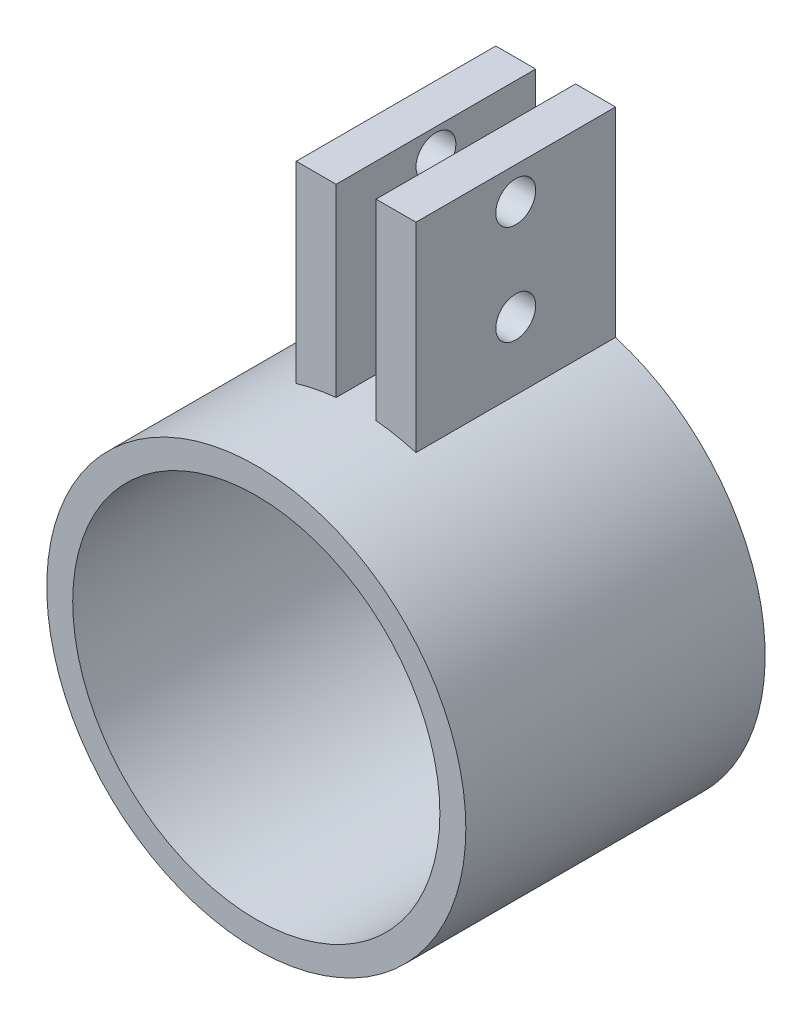
ISO-10303-21;
HEADER;
FILE_DESCRIPTION(('STEP AP214'),'2;1');
FILE_NAME('part.step','',(''),(''),'','','');
FILE_SCHEMA(('AUTOMOTIVE_DESIGN { 1 0 10303 214 1 1 1 1 }'));
ENDSEC;
DATA;
#1=APPLICATION_CONTEXT('core data for automotive mechanical design processes');
#2=APPLICATION_PROTOCOL_DEFINITION('international standard','automotive_design',2000,#1);
#3=PRODUCT_CONTEXT('',#1,'mechanical');
#4=PRODUCT('Part','Part','',(#3));
#5=PRODUCT_RELATED_PRODUCT_CATEGORY('part','',(#4));
#6=PRODUCT_DEFINITION_FORMATION('','',#4);
#7=PRODUCT_DEFINITION_CONTEXT('part definition',#1,'design');
#8=PRODUCT_DEFINITION('design','',#6,#7);
#9=PRODUCT_DEFINITION_SHAPE('','',#8);
#10=(LENGTH_UNIT() NAMED_UNIT(*) SI_UNIT(.MILLI.,.METRE.));
#11=(NAMED_UNIT(*) PLANE_ANGLE_UNIT() SI_UNIT($,.RADIAN.));
#12=(NAMED_UNIT(*) SI_UNIT($,.STERADIAN.) SOLID_ANGLE_UNIT());
#13=UNCERTAINTY_MEASURE_WITH_UNIT(LENGTH_MEASURE(1.E-05),#10,'distance_accuracy_value','');
#14=(GEOMETRIC_REPRESENTATION_CONTEXT(3) GLOBAL_UNCERTAINTY_ASSIGNED_CONTEXT((#13)) GLOBAL_UNIT_ASSIGNED_CONTEXT((#10,
#11,#12)) REPRESENTATION_CONTEXT('',''));
#15=CARTESIAN_POINT('',(0.,0.,0.));
#16=DIRECTION('',(0.,0.,1.));
#17=DIRECTION('',(1.,0.,0.));
#18=AXIS2_PLACEMENT_3D('',#15,#16,#17);
#19=CARTESIAN_POINT('',(0.,0.,15.));
#20=DIRECTION('',(0.,0.,-1.));
#21=DIRECTION('',(-1.,0.,0.));
#22=AXIS2_PLACEMENT_3D('',#19,#20,#21);
#23=CYLINDRICAL_SURFACE('',#22,10.5);
#24=CARTESIAN_POINT('',(0.,0.,15.));
#25=DIRECTION('',(0.,0.,1.));
#26=DIRECTION('',(1.,0.,0.));
#27=AXIS2_PLACEMENT_3D('',#24,#25,#26);
#28=CIRCLE('',#27,10.5);
#29=CARTESIAN_POINT('',(10.5,0.,15.));
#30=VERTEX_POINT('',#29);
#31=EDGE_CURVE('E184',#30,#30,#28,.T.);
#32=ORIENTED_EDGE('',*,*,#31,.F.);
#33=EDGE_LOOP('',(#32));
#34=FACE_BOUND('',#33,.T.);
#35=DIRECTION('',(0.,0.,-1.));
#36=VECTOR('',#35,1.);
#37=CARTESIAN_POINT('',(-3.,10.0623058987491,10.));
#38=LINE('',#37,#36);
#39=CARTESIAN_POINT('',(-3.,10.0623058987491,10.));
#40=VERTEX_POINT('',#39);
#41=CARTESIAN_POINT('',(-3.,10.0623058987491,0.));
#42=VERTEX_POINT('',#41);
#43=EDGE_CURVE('E126',#40,#42,#38,.T.);
#44=ORIENTED_EDGE('',*,*,#43,.T.);
#45=CARTESIAN_POINT('',(0.,0.,0.));
#46=DIRECTION('',(0.,0.,1.));
#47=DIRECTION('',(1.,0.,0.));
#48=AXIS2_PLACEMENT_3D('',#45,#46,#47);
#49=CIRCLE('',#48,10.5);
#50=CARTESIAN_POINT('',(3.,10.0623058987491,0.));
#51=VERTEX_POINT('',#50);
#52=EDGE_CURVE('E183',#42,#51,#49,.T.);
#53=ORIENTED_EDGE('',*,*,#52,.T.);
#54=DIRECTION('',(0.,0.,-1.));
#55=VECTOR('',#54,1.);
#56=CARTESIAN_POINT('',(3.,10.0623058987491,10.));
#57=LINE('',#56,#55);
#58=CARTESIAN_POINT('',(3.,10.0623058987491,10.));
#59=VERTEX_POINT('',#58);
#60=EDGE_CURVE('E168',#59,#51,#57,.T.);
#61=ORIENTED_EDGE('',*,*,#60,.F.);
#62=CARTESIAN_POINT('',(0.,0.,10.));
#63=DIRECTION('',(0.,0.,1.));
#64=DIRECTION('',(1.,0.,0.));
#65=AXIS2_PLACEMENT_3D('',#62,#63,#64);
#66=CIRCLE('',#65,10.5);
#67=CARTESIAN_POINT('',(1.,10.4522724801834,10.));
#68=VERTEX_POINT('',#67);
#69=EDGE_CURVE('E195',#59,#68,#66,.T.);
#70=ORIENTED_EDGE('',*,*,#69,.T.);
#71=DIRECTION('',(0.,0.,-1.));
#72=VECTOR('',#71,1.);
#73=CARTESIAN_POINT('',(1.,10.4522724801834,15.));
#74=LINE('',#73,#72);
#75=CARTESIAN_POINT('',(1.,10.4522724801834,0.));
#76=VERTEX_POINT('',#75);
#77=EDGE_CURVE('E198',#68,#76,#74,.T.);
#78=ORIENTED_EDGE('',*,*,#77,.T.);
#79=CARTESIAN_POINT('',(-1.,10.4522724801834,0.));
#80=VERTEX_POINT('',#79);
#81=EDGE_CURVE('E189',#76,#80,#49,.T.);
#82=ORIENTED_EDGE('',*,*,#81,.T.);
#83=DIRECTION('',(0.,0.,-1.));
#84=VECTOR('',#83,1.);
#85=CARTESIAN_POINT('',(-1.,10.4522724801834,15.));
#86=LINE('',#85,#84);
#87=CARTESIAN_POINT('',(-1.,10.4522724801834,10.));
#88=VERTEX_POINT('',#87);
#89=EDGE_CURVE('E11',#88,#80,#86,.T.);
#90=ORIENTED_EDGE('',*,*,#89,.F.);
#91=CARTESIAN_POINT('',(0.,0.,10.));
#92=DIRECTION('',(0.,0.,1.));
#93=DIRECTION('',(1.,0.,0.));
#94=AXIS2_PLACEMENT_3D('',#91,#92,#93);
#95=CIRCLE('',#94,10.5);
#96=EDGE_CURVE('E48',#88,#40,#95,.T.);
#97=ORIENTED_EDGE('',*,*,#96,.T.);
#98=EDGE_LOOP('',(#44,#53,#61,#70,#78,#82,#90,#97));
#99=FACE_BOUND('',#98,.T.);
#100=ADVANCED_FACE('F39',(#34,#99),#23,.T.);
#101=CARTESIAN_POINT('',(0.,0.,15.));
#102=DIRECTION('',(0.,0.,1.));
#103=DIRECTION('',(1.,0.,0.));
#104=AXIS2_PLACEMENT_3D('',#101,#102,#103);
#105=PLANE('',#104);
#106=ORIENTED_EDGE('',*,*,#31,.T.);
#107=EDGE_LOOP('',(#106));
#108=FACE_BOUND('',#107,.T.);
#109=CARTESIAN_POINT('',(0.,0.,15.));
#110=DIRECTION('',(0.,0.,1.));
#111=DIRECTION('',(1.,0.,0.));
#112=AXIS2_PLACEMENT_3D('',#109,#110,#111);
#113=CIRCLE('',#112,9.2);
#114=CARTESIAN_POINT('',(9.2,0.,15.));
#115=VERTEX_POINT('',#114);
#116=EDGE_CURVE('E172',#115,#115,#113,.T.);
#117=ORIENTED_EDGE('',*,*,#116,.F.);
#118=EDGE_LOOP('',(#117));
#119=FACE_BOUND('',#118,.T.);
#120=ADVANCED_FACE('F276',(#108,#119),#105,.T.);
#121=CARTESIAN_POINT('',(0.,0.,0.));
#122=DIRECTION('',(0.,0.,1.));
#123=DIRECTION('',(1.,0.,0.));
#124=AXIS2_PLACEMENT_3D('',#121,#122,#123);
#125=PLANE('',#124);
#126=ORIENTED_EDGE('',*,*,#52,.F.);
#127=DIRECTION('',(0.,1.,0.));
#128=VECTOR('',#127,1.);
#129=CARTESIAN_POINT('',(-3.,10.0623058987491,0.));
#130=LINE('',#129,#128);
#131=CARTESIAN_POINT('',(-3.,19.7082439194738,0.));
#132=VERTEX_POINT('',#131);
#133=EDGE_CURVE('E138',#42,#132,#130,.T.);
#134=ORIENTED_EDGE('',*,*,#133,.T.);
#135=DIRECTION('',(-1.,0.,0.));
#136=VECTOR('',#135,1.);
#137=CARTESIAN_POINT('',(-1.,19.7082439194738,0.));
#138=LINE('',#137,#136);
#139=CARTESIAN_POINT('',(-1.,19.7082439194738,0.));
#140=VERTEX_POINT('',#139);
#141=EDGE_CURVE('E118',#140,#132,#138,.T.);
#142=ORIENTED_EDGE('',*,*,#141,.F.);
#143=DIRECTION('',(0.,1.,0.));
#144=VECTOR('',#143,1.);
#145=CARTESIAN_POINT('',(-1.,10.0623058987491,0.));
#146=LINE('',#145,#144);
#147=EDGE_CURVE('E128',#80,#140,#146,.T.);
#148=ORIENTED_EDGE('',*,*,#147,.F.);
#149=ORIENTED_EDGE('',*,*,#81,.F.);
#150=DIRECTION('',(0.,1.,0.));
#151=VECTOR('',#150,1.);
#152=CARTESIAN_POINT('',(1.,10.0623058987491,0.));
#153=LINE('',#152,#151);
#154=CARTESIAN_POINT('',(1.,20.0623058987491,0.));
#155=VERTEX_POINT('',#154);
#156=EDGE_CURVE('E145',#76,#155,#153,.T.);
#157=ORIENTED_EDGE('',*,*,#156,.T.);
#158=DIRECTION('',(-1.,0.,0.));
#159=VECTOR('',#158,1.);
#160=CARTESIAN_POINT('',(3.,20.0623058987491,0.));
#161=LINE('',#160,#159);
#162=CARTESIAN_POINT('',(3.,20.0623058987491,0.));
#163=VERTEX_POINT('',#162);
#164=EDGE_CURVE('E162',#163,#155,#161,.T.);
#165=ORIENTED_EDGE('',*,*,#164,.F.);
#166=DIRECTION('',(0.,1.,0.));
#167=VECTOR('',#166,1.);
#168=CARTESIAN_POINT('',(3.,10.0623058987491,0.));
#169=LINE('',#168,#167);
#170=EDGE_CURVE('E152',#51,#163,#169,.T.);
#171=ORIENTED_EDGE('',*,*,#170,.F.);
#172=EDGE_LOOP('',(#126,#134,#142,#148,#149,#157,#165,#171));
#173=FACE_BOUND('',#172,.T.);
#174=ADVANCED_FACE('F261',(#173),#125,.F.);
#175=CARTESIAN_POINT('',(0.,0.,15.));
#176=DIRECTION('',(0.,0.,-1.));
#177=DIRECTION('',(-1.,0.,0.));
#178=AXIS2_PLACEMENT_3D('',#175,#176,#177);
#179=CYLINDRICAL_SURFACE('',#178,9.2);
#180=CARTESIAN_POINT('',(0.,0.,2.));
#181=DIRECTION('',(0.,0.,1.));
#182=DIRECTION('',(1.,0.,0.));
#183=AXIS2_PLACEMENT_3D('',#180,#181,#182);
#184=CIRCLE('',#183,9.2);
#185=CARTESIAN_POINT('',(9.2,0.,2.));
#186=VERTEX_POINT('',#185);
#187=EDGE_CURVE('E188',#186,#186,#184,.T.);
#188=ORIENTED_EDGE('',*,*,#187,.F.);
#189=EDGE_LOOP('',(#188));
#190=FACE_BOUND('',#189,.T.);
#191=ORIENTED_EDGE('',*,*,#116,.T.);
#192=EDGE_LOOP('',(#191));
#193=FACE_BOUND('',#192,.T.);
#194=ADVANCED_FACE('F287',(#190,#193),#179,.F.);
#195=CARTESIAN_POINT('',(0.,0.,2.));
#196=DIRECTION('',(0.,0.,1.));
#197=DIRECTION('',(1.,0.,0.));
#198=AXIS2_PLACEMENT_3D('',#195,#196,#197);
#199=PLANE('',#198);
#200=ORIENTED_EDGE('',*,*,#187,.T.);
#201=EDGE_LOOP('',(#200));
#202=FACE_BOUND('',#201,.T.);
#203=ADVANCED_FACE('F242',(#202),#199,.T.);
#204=CARTESIAN_POINT('',(1.,10.0623058987491,10.));
#205=DIRECTION('',(-1.,0.,0.));
#206=DIRECTION('',(0.,0.,1.));
#207=AXIS2_PLACEMENT_3D('',#204,#205,#206);
#208=PLANE('',#207);
#209=CARTESIAN_POINT('',(1.,13.4522724801834,5.));
#210=DIRECTION('',(-1.,0.,0.));
#211=DIRECTION('',(0.,0.,1.));
#212=AXIS2_PLACEMENT_3D('',#209,#210,#211);
#213=CIRCLE('',#212,1.);
#214=CARTESIAN_POINT('',(1.,13.4522724801834,6.));
#215=VERTEX_POINT('',#214);
#216=EDGE_CURVE('E133',#215,#215,#213,.T.);
#217=ORIENTED_EDGE('',*,*,#216,.F.);
#218=EDGE_LOOP('',(#217));
#219=FACE_BOUND('',#218,.T.);
#220=CARTESIAN_POINT('',(1.,18.4522724801834,5.));
#221=DIRECTION('',(-1.,0.,0.));
#222=DIRECTION('',(0.,0.,1.));
#223=AXIS2_PLACEMENT_3D('',#220,#221,#222);
#224=CIRCLE('',#223,1.);
#225=CARTESIAN_POINT('',(1.,18.4522724801834,6.));
#226=VERTEX_POINT('',#225);
#227=EDGE_CURVE('E217',#226,#226,#224,.T.);
#228=ORIENTED_EDGE('',*,*,#227,.F.);
#229=EDGE_LOOP('',(#228));
#230=FACE_BOUND('',#229,.T.);
#231=ORIENTED_EDGE('',*,*,#77,.F.);
#232=DIRECTION('',(0.,1.,0.));
#233=VECTOR('',#232,1.);
#234=CARTESIAN_POINT('',(1.,10.0623058987491,10.));
#235=LINE('',#234,#233);
#236=CARTESIAN_POINT('',(1.,20.0623058987491,10.));
#237=VERTEX_POINT('',#236);
#238=EDGE_CURVE('E148',#68,#237,#235,.T.);
#239=ORIENTED_EDGE('',*,*,#238,.T.);
#240=DIRECTION('',(0.,0.,-1.));
#241=VECTOR('',#240,1.);
#242=CARTESIAN_POINT('',(1.,20.0623058987491,10.));
#243=LINE('',#242,#241);
#244=EDGE_CURVE('E159',#237,#155,#243,.T.);
#245=ORIENTED_EDGE('',*,*,#244,.T.);
#246=ORIENTED_EDGE('',*,*,#156,.F.);
#247=EDGE_LOOP('',(#231,#239,#245,#246));
#248=FACE_BOUND('',#247,.T.);
#249=ADVANCED_FACE('F238',(#219,#230,#248),#208,.T.);
#250=CARTESIAN_POINT('',(3.,10.0623058987491,10.));
#251=DIRECTION('',(-1.,0.,0.));
#252=DIRECTION('',(0.,0.,1.));
#253=AXIS2_PLACEMENT_3D('',#250,#251,#252);
#254=PLANE('',#253);
#255=CARTESIAN_POINT('',(3.,13.4522724801834,5.));
#256=DIRECTION('',(-1.,0.,0.));
#257=DIRECTION('',(0.,0.,1.));
#258=AXIS2_PLACEMENT_3D('',#255,#256,#257);
#259=CIRCLE('',#258,1.);
#260=CARTESIAN_POINT('',(3.,13.4522724801834,6.));
#261=VERTEX_POINT('',#260);
#262=EDGE_CURVE('E226',#261,#261,#259,.T.);
#263=ORIENTED_EDGE('',*,*,#262,.T.);
#264=EDGE_LOOP('',(#263));
#265=FACE_BOUND('',#264,.T.);
#266=CARTESIAN_POINT('',(3.,18.4522724801834,5.));
#267=DIRECTION('',(-1.,0.,0.));
#268=DIRECTION('',(0.,0.,1.));
#269=AXIS2_PLACEMENT_3D('',#266,#267,#268);
#270=CIRCLE('',#269,1.);
#271=CARTESIAN_POINT('',(3.,18.4522724801834,6.));
#272=VERTEX_POINT('',#271);
#273=EDGE_CURVE('E211',#272,#272,#270,.T.);
#274=ORIENTED_EDGE('',*,*,#273,.T.);
#275=EDGE_LOOP('',(#274));
#276=FACE_BOUND('',#275,.T.);
#277=ORIENTED_EDGE('',*,*,#170,.T.);
#278=DIRECTION('',(0.,0.,-1.));
#279=VECTOR('',#278,1.);
#280=CARTESIAN_POINT('',(3.,20.0623058987491,10.));
#281=LINE('',#280,#279);
#282=CARTESIAN_POINT('',(3.,20.0623058987491,10.));
#283=VERTEX_POINT('',#282);
#284=EDGE_CURVE('E173',#283,#163,#281,.T.);
#285=ORIENTED_EDGE('',*,*,#284,.F.);
#286=DIRECTION('',(0.,1.,0.));
#287=VECTOR('',#286,1.);
#288=CARTESIAN_POINT('',(3.,10.0623058987491,10.));
#289=LINE('',#288,#287);
#290=EDGE_CURVE('E156',#59,#283,#289,.T.);
#291=ORIENTED_EDGE('',*,*,#290,.F.);
#292=ORIENTED_EDGE('',*,*,#60,.T.);
#293=EDGE_LOOP('',(#277,#285,#291,#292));
#294=FACE_BOUND('',#293,.T.);
#295=ADVANCED_FACE('F241',(#265,#276,#294),#254,.F.);
#296=CARTESIAN_POINT('',(3.,20.0623058987491,10.));
#297=DIRECTION('',(0.,-1.,0.));
#298=DIRECTION('',(0.,0.,-1.));
#299=AXIS2_PLACEMENT_3D('',#296,#297,#298);
#300=PLANE('',#299);
#301=ORIENTED_EDGE('',*,*,#164,.T.);
#302=ORIENTED_EDGE('',*,*,#244,.F.);
#303=DIRECTION('',(-1.,0.,0.));
#304=VECTOR('',#303,1.);
#305=CARTESIAN_POINT('',(3.,20.0623058987491,10.));
#306=LINE('',#305,#304);
#307=EDGE_CURVE('E151',#283,#237,#306,.T.);
#308=ORIENTED_EDGE('',*,*,#307,.F.);
#309=ORIENTED_EDGE('',*,*,#284,.T.);
#310=EDGE_LOOP('',(#301,#302,#308,#309));
#311=FACE_BOUND('',#310,.T.);
#312=ADVANCED_FACE('F257',(#311),#300,.F.);
#313=CARTESIAN_POINT('',(0.,0.,10.));
#314=DIRECTION('',(0.,0.,1.));
#315=DIRECTION('',(1.,0.,0.));
#316=AXIS2_PLACEMENT_3D('',#313,#314,#315);
#317=PLANE('',#316);
#318=ORIENTED_EDGE('',*,*,#69,.F.);
#319=ORIENTED_EDGE('',*,*,#290,.T.);
#320=ORIENTED_EDGE('',*,*,#307,.T.);
#321=ORIENTED_EDGE('',*,*,#238,.F.);
#322=EDGE_LOOP('',(#318,#319,#320,#321));
#323=FACE_BOUND('',#322,.T.);
#324=ADVANCED_FACE('F251',(#323),#317,.T.);
#325=CARTESIAN_POINT('',(-1.,10.0623058987491,10.));
#326=DIRECTION('',(-1.,0.,0.));
#327=DIRECTION('',(0.,0.,1.));
#328=AXIS2_PLACEMENT_3D('',#325,#326,#327);
#329=PLANE('',#328);
#330=CARTESIAN_POINT('',(-1.,13.4522724801834,5.));
#331=DIRECTION('',(-1.,0.,0.));
#332=DIRECTION('',(0.,0.,1.));
#333=AXIS2_PLACEMENT_3D('',#330,#331,#332);
#334=CIRCLE('',#333,1.);
#335=CARTESIAN_POINT('',(-1.,13.4522724801834,6.));
#336=VERTEX_POINT('',#335);
#337=EDGE_CURVE('E223',#336,#336,#334,.T.);
#338=ORIENTED_EDGE('',*,*,#337,.T.);
#339=EDGE_LOOP('',(#338));
#340=FACE_BOUND('',#339,.T.);
#341=CARTESIAN_POINT('',(-1.,18.4522724801834,5.));
#342=DIRECTION('',(-1.,0.,0.));
#343=DIRECTION('',(0.,0.,1.));
#344=AXIS2_PLACEMENT_3D('',#341,#342,#343);
#345=CIRCLE('',#344,1.);
#346=CARTESIAN_POINT('',(-1.,18.4522724801834,6.));
#347=VERTEX_POINT('',#346);
#348=EDGE_CURVE('E206',#347,#347,#345,.T.);
#349=ORIENTED_EDGE('',*,*,#348,.T.);
#350=EDGE_LOOP('',(#349));
#351=FACE_BOUND('',#350,.T.);
#352=DIRECTION('',(0.,1.,0.));
#353=VECTOR('',#352,1.);
#354=CARTESIAN_POINT('',(-1.,10.0623058987491,10.));
#355=LINE('',#354,#353);
#356=CARTESIAN_POINT('',(-1.,19.7082439194738,10.));
#357=VERTEX_POINT('',#356);
#358=EDGE_CURVE('E108',#88,#357,#355,.T.);
#359=ORIENTED_EDGE('',*,*,#358,.F.);
#360=ORIENTED_EDGE('',*,*,#89,.T.);
#361=ORIENTED_EDGE('',*,*,#147,.T.);
#362=DIRECTION('',(0.,0.,-1.));
#363=VECTOR('',#362,1.);
#364=CARTESIAN_POINT('',(-1.,19.7082439194738,10.));
#365=LINE('',#364,#363);
#366=EDGE_CURVE('E123',#357,#140,#365,.T.);
#367=ORIENTED_EDGE('',*,*,#366,.F.);
#368=EDGE_LOOP('',(#359,#360,#361,#367));
#369=FACE_BOUND('',#368,.T.);
#370=ADVANCED_FACE('F264',(#340,#351,#369),#329,.F.);
#371=CARTESIAN_POINT('',(-3.,10.0623058987491,10.));
#372=DIRECTION('',(-1.,0.,0.));
#373=DIRECTION('',(0.,0.,1.));
#374=AXIS2_PLACEMENT_3D('',#371,#372,#373);
#375=PLANE('',#374);
#376=CARTESIAN_POINT('',(-3.,13.4522724801834,5.));
#377=DIRECTION('',(-1.,0.,0.));
#378=DIRECTION('',(0.,0.,1.));
#379=AXIS2_PLACEMENT_3D('',#376,#377,#378);
#380=CIRCLE('',#379,1.);
#381=CARTESIAN_POINT('',(-3.,13.4522724801834,6.));
#382=VERTEX_POINT('',#381);
#383=EDGE_CURVE('E42',#382,#382,#380,.T.);
#384=ORIENTED_EDGE('',*,*,#383,.F.);
#385=EDGE_LOOP('',(#384));
#386=FACE_BOUND('',#385,.T.);
#387=CARTESIAN_POINT('',(-3.,18.4522724801834,5.));
#388=DIRECTION('',(-1.,0.,0.));
#389=DIRECTION('',(0.,0.,1.));
#390=AXIS2_PLACEMENT_3D('',#387,#388,#389);
#391=CIRCLE('',#390,1.);
#392=CARTESIAN_POINT('',(-3.,18.4522724801834,6.));
#393=VERTEX_POINT('',#392);
#394=EDGE_CURVE('E203',#393,#393,#391,.T.);
#395=ORIENTED_EDGE('',*,*,#394,.F.);
#396=EDGE_LOOP('',(#395));
#397=FACE_BOUND('',#396,.T.);
#398=ORIENTED_EDGE('',*,*,#133,.F.);
#399=ORIENTED_EDGE('',*,*,#43,.F.);
#400=DIRECTION('',(0.,1.,0.));
#401=VECTOR('',#400,1.);
#402=CARTESIAN_POINT('',(-3.,10.0623058987491,10.));
#403=LINE('',#402,#401);
#404=CARTESIAN_POINT('',(-3.,19.7082439194738,10.));
#405=VERTEX_POINT('',#404);
#406=EDGE_CURVE('E106',#40,#405,#403,.T.);
#407=ORIENTED_EDGE('',*,*,#406,.T.);
#408=DIRECTION('',(0.,0.,-1.));
#409=VECTOR('',#408,1.);
#410=CARTESIAN_POINT('',(-3.,19.7082439194738,10.));
#411=LINE('',#410,#409);
#412=EDGE_CURVE('E115',#405,#132,#411,.T.);
#413=ORIENTED_EDGE('',*,*,#412,.T.);
#414=EDGE_LOOP('',(#398,#399,#407,#413));
#415=FACE_BOUND('',#414,.T.);
#416=ADVANCED_FACE('F125',(#386,#397,#415),#375,.T.);
#417=CARTESIAN_POINT('',(-1.,19.7082439194738,10.));
#418=DIRECTION('',(0.,-1.,0.));
#419=DIRECTION('',(0.,0.,-1.));
#420=AXIS2_PLACEMENT_3D('',#417,#418,#419);
#421=PLANE('',#420);
#422=ORIENTED_EDGE('',*,*,#141,.T.);
#423=ORIENTED_EDGE('',*,*,#412,.F.);
#424=DIRECTION('',(-1.,0.,0.));
#425=VECTOR('',#424,1.);
#426=CARTESIAN_POINT('',(-1.,19.7082439194738,10.));
#427=LINE('',#426,#425);
#428=EDGE_CURVE('E102',#357,#405,#427,.T.);
#429=ORIENTED_EDGE('',*,*,#428,.F.);
#430=ORIENTED_EDGE('',*,*,#366,.T.);
#431=EDGE_LOOP('',(#422,#423,#429,#430));
#432=FACE_BOUND('',#431,.T.);
#433=ADVANCED_FACE('F116',(#432),#421,.F.);
#434=CARTESIAN_POINT('',(0.,0.,10.));
#435=DIRECTION('',(0.,0.,1.));
#436=DIRECTION('',(1.,0.,0.));
#437=AXIS2_PLACEMENT_3D('',#434,#435,#436);
#438=PLANE('',#437);
#439=ORIENTED_EDGE('',*,*,#96,.F.);
#440=ORIENTED_EDGE('',*,*,#358,.T.);
#441=ORIENTED_EDGE('',*,*,#428,.T.);
#442=ORIENTED_EDGE('',*,*,#406,.F.);
#443=EDGE_LOOP('',(#439,#440,#441,#442));
#444=FACE_BOUND('',#443,.T.);
#445=ADVANCED_FACE('F104',(#444),#438,.T.);
#446=CARTESIAN_POINT('',(10.5,18.4522724801834,5.));
#447=DIRECTION('',(-1.,0.,0.));
#448=DIRECTION('',(0.,0.,1.));
#449=AXIS2_PLACEMENT_3D('',#446,#447,#448);
#450=CYLINDRICAL_SURFACE('',#449,1.);
#451=ORIENTED_EDGE('',*,*,#394,.T.);
#452=EDGE_LOOP('',(#451));
#453=FACE_BOUND('',#452,.T.);
#454=ORIENTED_EDGE('',*,*,#348,.F.);
#455=EDGE_LOOP('',(#454));
#456=FACE_BOUND('',#455,.T.);
#457=ADVANCED_FACE('F374',(#453,#456),#450,.F.);
#458=CARTESIAN_POINT('',(10.5,13.4522724801834,5.));
#459=DIRECTION('',(-1.,0.,0.));
#460=DIRECTION('',(0.,0.,1.));
#461=AXIS2_PLACEMENT_3D('',#458,#459,#460);
#462=CYLINDRICAL_SURFACE('',#461,1.);
#463=ORIENTED_EDGE('',*,*,#383,.T.);
#464=EDGE_LOOP('',(#463));
#465=FACE_BOUND('',#464,.T.);
#466=ORIENTED_EDGE('',*,*,#337,.F.);
#467=EDGE_LOOP('',(#466));
#468=FACE_BOUND('',#467,.T.);
#469=ADVANCED_FACE('F382',(#465,#468),#462,.F.);
#470=ORIENTED_EDGE('',*,*,#227,.T.);
#471=EDGE_LOOP('',(#470));
#472=FACE_BOUND('',#471,.T.);
#473=ORIENTED_EDGE('',*,*,#273,.F.);
#474=EDGE_LOOP('',(#473));
#475=FACE_BOUND('',#474,.T.);
#476=ADVANCED_FACE('F384',(#472,#475),#450,.F.);
#477=ORIENTED_EDGE('',*,*,#216,.T.);
#478=EDGE_LOOP('',(#477));
#479=FACE_BOUND('',#478,.T.);
#480=ORIENTED_EDGE('',*,*,#262,.F.);
#481=EDGE_LOOP('',(#480));
#482=FACE_BOUND('',#481,.T.);
#483=ADVANCED_FACE('F235',(#479,#482),#462,.F.);
#484=CLOSED_SHELL('',(#100,#120,#174,#194,#203,#249,#295,#312,#324,#370,#416,#433,#445,#457,
#469,#476,#483));
#485=MANIFOLD_SOLID_BREP('B2',#484);
#486=ADVANCED_BREP_SHAPE_REPRESENTATION('',(#18,#485),#14);
#487=SHAPE_DEFINITION_REPRESENTATION(#9,#486);
ENDSEC;
END-ISO-10303-21;
